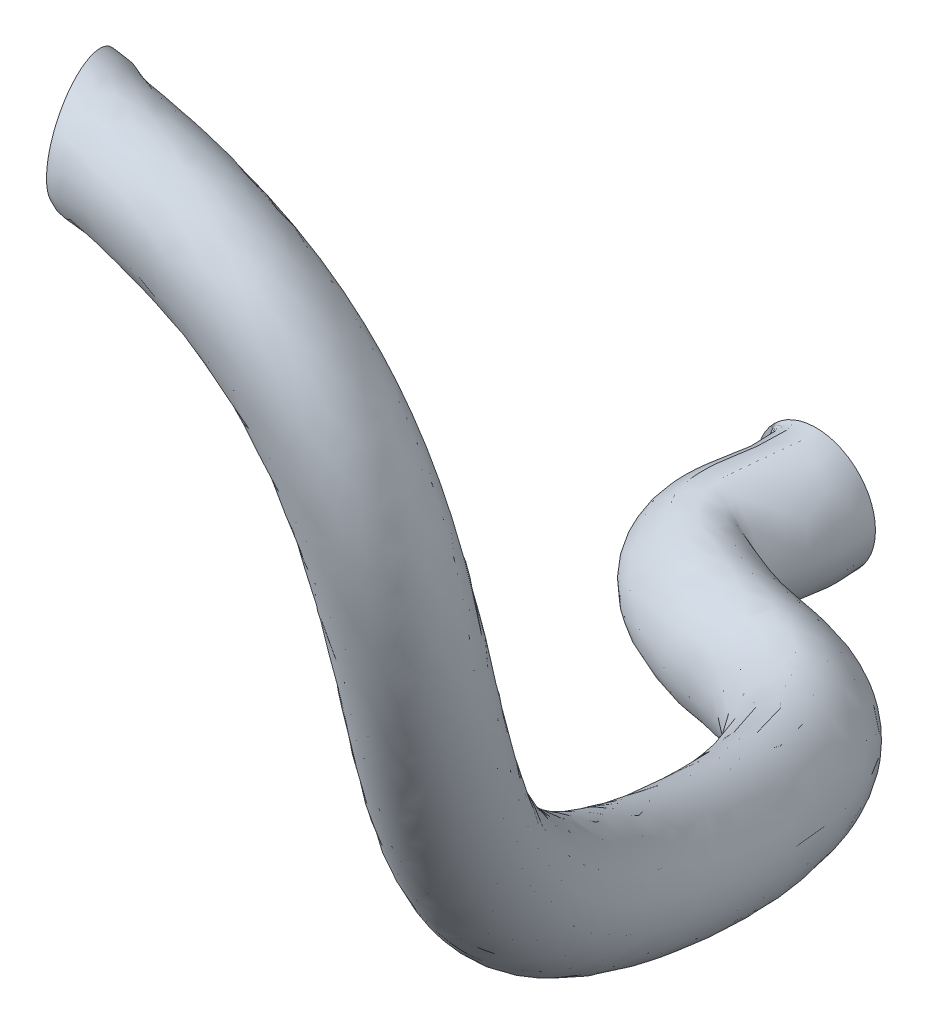
ISO-10303-21;
HEADER;
FILE_DESCRIPTION(('STEP AP214'),'2;1');
FILE_NAME('part.step','',(''),(''),'','','');
FILE_SCHEMA(('AUTOMOTIVE_DESIGN { 1 0 10303 214 1 1 1 1 }'));
ENDSEC;
DATA;
#1=APPLICATION_CONTEXT('core data for automotive mechanical design processes');
#2=APPLICATION_PROTOCOL_DEFINITION('international standard','automotive_design',2000,#1);
#3=PRODUCT_CONTEXT('',#1,'mechanical');
#4=PRODUCT('Part','Part','',(#3));
#5=PRODUCT_RELATED_PRODUCT_CATEGORY('part','',(#4));
#6=PRODUCT_DEFINITION_FORMATION('','',#4);
#7=PRODUCT_DEFINITION_CONTEXT('part definition',#1,'design');
#8=PRODUCT_DEFINITION('design','',#6,#7);
#9=PRODUCT_DEFINITION_SHAPE('','',#8);
#10=(LENGTH_UNIT() NAMED_UNIT(*) SI_UNIT(.MILLI.,.METRE.));
#11=(NAMED_UNIT(*) PLANE_ANGLE_UNIT() SI_UNIT($,.RADIAN.));
#12=(NAMED_UNIT(*) SI_UNIT($,.STERADIAN.) SOLID_ANGLE_UNIT());
#13=UNCERTAINTY_MEASURE_WITH_UNIT(LENGTH_MEASURE(1.E-05),#10,'distance_accuracy_value','');
#14=(GEOMETRIC_REPRESENTATION_CONTEXT(3) GLOBAL_UNCERTAINTY_ASSIGNED_CONTEXT((#13)) GLOBAL_UNIT_ASSIGNED_CONTEXT((#10,
#11,#12)) REPRESENTATION_CONTEXT('',''));
#15=CARTESIAN_POINT('',(0.,0.,0.));
#16=DIRECTION('',(0.,0.,1.));
#17=DIRECTION('',(1.,0.,0.));
#18=AXIS2_PLACEMENT_3D('',#15,#16,#17);
#19=CARTESIAN_POINT('',(-24.8878615693441,-4.2304804281548,-4.49999999999991));
#20=CARTESIAN_POINT('',(-24.5646060974888,-4.22796489126231,-2.55649872578834));
#21=CARTESIAN_POINT('',(-25.1030534950202,-4.23205726124832,-1.22840390737119));
#22=CARTESIAN_POINT('',(-25.413106233209,-4.23459618045612,0.76757658714747));
#23=CARTESIAN_POINT('',(-25.2022709289863,-4.23323848687239,1.43771966918417));
#24=CARTESIAN_POINT('',(-24.6043829366221,-4.2288643553895,1.03015312019135));
#25=CARTESIAN_POINT('',(-24.3728298522423,-4.22837394427956,1.05607574828052));
#26=CARTESIAN_POINT('',(-23.5333543372944,-4.23509486533892,1.29094542338443));
#27=CARTESIAN_POINT('',(-23.0122900733621,-4.24646464015012,1.41890242621499));
#28=CARTESIAN_POINT('',(-21.3029778738389,-4.27736718960124,1.72369019564689));
#29=CARTESIAN_POINT('',(-19.7867082582139,-4.30556048012508,1.83597786138884));
#30=CARTESIAN_POINT('',(-14.2154728812544,-3.88382735188603,4.7653411880431));
#31=CARTESIAN_POINT('',(-12.4114377277019,-3.09076446981266,8.48799900523907));
#32=CARTESIAN_POINT('',(-9.46436730094952,-0.879239149500008,16.0423497595564));
#33=CARTESIAN_POINT('',(-8.427648458505,0.601201151193356,20.1422658495879));
#34=CARTESIAN_POINT('',(-5.4688429849217,5.190969608008,28.5116664110525));
#35=CARTESIAN_POINT('',(-3.46496980335747,8.77740715301397,32.3319993496395));
#36=CARTESIAN_POINT('',(-0.817829924241152,14.807205024518,36.8451318202008));
#37=CARTESIAN_POINT('',(0.00334889550446943,16.9235975650303,38.1413650839852));
#38=CARTESIAN_POINT('',(1.38629479996227,21.2596439688515,40.3802270445532));
#39=CARTESIAN_POINT('',(1.99832213598993,23.4480030711831,41.3963450150199));
#40=CARTESIAN_POINT('',(2.51672044384308,28.0203979897937,42.6945537851135));
#41=CARTESIAN_POINT('',(2.42140900852664,30.3278802480842,43.0589216726515));
#42=CARTESIAN_POINT('',(1.77934216727178,34.5878310271851,43.8007959879889));
#43=CARTESIAN_POINT('',(1.18667629531365,36.5846831358808,44.0993980823092));
#44=CARTESIAN_POINT('',(-1.61579174893988,41.9575666929227,44.7997950061252));
#45=CARTESIAN_POINT('',(-4.88844543797425,44.5121311354086,44.9320937160294));
#46=CARTESIAN_POINT('',(-10.4836559159759,46.2411596474251,45.1885953474421));
#47=CARTESIAN_POINT('',(-11.305458718614,46.4633137662849,45.2119410263556));
#48=CARTESIAN_POINT('',(-12.171526602053,46.69669675658,45.1640416738391));
#49=CARTESIAN_POINT('',(-12.3801287722566,46.7546587955755,45.1268870463093));
#50=CARTESIAN_POINT('',(-12.7254454729642,46.8590540619634,45.0155404350546));
#51=CARTESIAN_POINT('',(-13.2208295139413,46.970207355954,45.0590724851351));
#52=CARTESIAN_POINT('',(-13.6107610039798,47.0583487138794,45.1043830996129));
#53=CARTESIAN_POINT('',(-24.8878615693441,-2.6596841013599,-4.49999999999991));
#54=CARTESIAN_POINT('',(-24.5646143846284,-2.65716848012922,-2.5519287429446));
#55=CARTESIAN_POINT('',(-25.1046509655989,-2.66127306220809,-1.22244045701026));
#56=CARTESIAN_POINT('',(-25.4147723008567,-2.66381294043069,0.773769460652891));
#57=CARTESIAN_POINT('',(-25.2025005381344,-2.66244487482944,1.44272059623179));
#58=CARTESIAN_POINT('',(-24.6041813189911,-2.65806637932871,1.02787142081473));
#59=CARTESIAN_POINT('',(-24.3722940995891,-2.65757115779752,1.05495982724658));
#60=CARTESIAN_POINT('',(-23.5245837672909,-2.66431954077901,1.29424438588244));
#61=CARTESIAN_POINT('',(-22.9920191805409,-2.67581625049957,1.42701567310858));
#62=CARTESIAN_POINT('',(-21.2724422406209,-2.7068825001478,1.73341160505658));
#63=CARTESIAN_POINT('',(-19.7822568846957,-2.73320807572521,1.84518752672371));
#64=CARTESIAN_POINT('',(-14.421738935216,-2.32054285806685,4.69523981166026));
#65=CARTESIAN_POINT('',(-12.6884852694002,-1.55372658272302,8.29230356656181));
#66=CARTESIAN_POINT('',(-9.81916905745962,0.607817857476395,15.6677637439267));
#67=CARTESIAN_POINT('',(-8.8023978851523,2.06300890983307,19.6853580626797));
#68=CARTESIAN_POINT('',(-5.94035612181905,6.50621221363957,27.7662508543834));
#69=CARTESIAN_POINT('',(-4.00585267080839,9.97072294574679,31.4469012046742));
#70=CARTESIAN_POINT('',(-1.44944432894534,15.8008528175429,35.8014522580994));
#71=CARTESIAN_POINT('',(-0.65634915138676,17.8475270113853,37.0522336574479));
#72=CARTESIAN_POINT('',(0.676898560770395,22.0364652093027,39.210457778667));
#73=CARTESIAN_POINT('',(1.31204732643601,24.1513554482756,40.1626009634191));
#74=CARTESIAN_POINT('',(1.61513438304508,28.5426894846685,41.5104270054655));
#75=CARTESIAN_POINT('',(1.33699476495147,30.7249903517053,41.9780669391968));
#76=CARTESIAN_POINT('',(0.524492010256694,34.6783306697652,42.8421205793201));
#77=CARTESIAN_POINT('',(-0.104963151791936,36.4901965698746,43.1864482355731));
#78=CARTESIAN_POINT('',(-2.83383630630969,41.2512882735633,43.98844716122));
#79=CARTESIAN_POINT('',(-5.74425050240786,43.3443918445749,44.2245274515886));
#80=CARTESIAN_POINT('',(-10.9452537304344,44.9264654788377,44.4607838541198));
#81=CARTESIAN_POINT('',(-11.7331525061249,45.1388759716117,44.4828111531887));
#82=CARTESIAN_POINT('',(-12.5476261843569,45.3569899474006,44.4350303229199));
#83=CARTESIAN_POINT('',(-12.7367504494539,45.4091229720769,44.398611656623));
#84=CARTESIAN_POINT('',(-13.0338445708985,45.49998004545,44.2903931804137));
#85=CARTESIAN_POINT('',(-13.5521978656232,45.6176067933511,44.3320394792633));
#86=CARTESIAN_POINT('',(-13.9598449960138,45.7101320623714,44.3778479474183));
#87=CARTESIAN_POINT('',(-26.3170652425492,-1.2304804281548,-4.49999999999991));
#88=CARTESIAN_POINT('',(-25.9953007217943,-1.22799353344375,-3.0943974079674));
#89=CARTESIAN_POINT('',(-26.3458520292034,-1.23064193433917,-1.92812570019491));
#90=CARTESIAN_POINT('',(-26.6503610578025,-1.23308829522631,0.0584900875496806));
#91=CARTESIAN_POINT('',(-26.613469039452,-1.23298912070251,0.885825135594758));
#92=CARTESIAN_POINT('',(-26.0463378790452,-1.2289930574938,1.38365073192303));
#93=CARTESIAN_POINT('',(-25.6749880449954,-1.22697202409296,1.67198297434717));
#94=CARTESIAN_POINT('',(-24.6078974603529,-1.23051615495049,2.24027941789326));
#95=CARTESIAN_POINT('',(-23.9569665689047,-1.23924466801511,2.4764415470262));
#96=CARTESIAN_POINT('',(-21.9918069456176,-1.27030706062629,2.97745774074335));
#97=CARTESIAN_POINT('',(-20.5386848179186,-1.29571763006718,3.09777432549534));
#98=CARTESIAN_POINT('',(-16.0407484848798,-1.0014136772814,5.25150398657327));
#99=CARTESIAN_POINT('',(-14.3443075926483,-0.372594527048156,8.32773412475361));
#100=CARTESIAN_POINT('',(-11.5376298767001,1.62441974353067,15.2785480649164));
#101=CARTESIAN_POINT('',(-10.5245821800283,3.01632629361994,19.2211118777696));
#102=CARTESIAN_POINT('',(-7.73566371225351,7.3025194953844,27.2775219442118));
#103=CARTESIAN_POINT('',(-5.84114104240599,10.6638307228618,30.9416312997578));
#104=CARTESIAN_POINT('',(-3.33301317921254,16.2980259015031,35.2583897490917));
#105=CARTESIAN_POINT('',(-2.55396706012759,18.2723577486996,36.4941351130002));
#106=CARTESIAN_POINT('',(-1.24031679465598,22.2909931886233,38.6168167619467));
#107=CARTESIAN_POINT('',(-0.594211505903249,24.326555569935,39.4868841425441));
#108=CARTESIAN_POINT('',(-0.353231883458828,28.4019410151263,41.0341548753933));
#109=CARTESIAN_POINT('',(-0.653037345844485,30.3684714337197,41.7343181441356));
#110=CARTESIAN_POINT('',(-1.36320218023664,33.9148308059667,42.8627510722104));
#111=CARTESIAN_POINT('',(-1.89129699779102,35.5108837340509,43.3013180961627));
#112=CARTESIAN_POINT('',(-4.12468800256378,39.6327415046493,44.3219418509533));
#113=CARTESIAN_POINT('',(-6.36125120771238,41.427072871021,44.7296150741728));
#114=CARTESIAN_POINT('',(-11.0064443966996,42.9649955122185,44.9515016702632));
#115=CARTESIAN_POINT('',(-11.759328476982,43.1794483037047,44.9783001764761));
#116=CARTESIAN_POINT('',(-12.5688229367121,43.4040249366521,44.9554156690189));
#117=CARTESIAN_POINT('',(-12.7740120057758,43.4605603047749,44.9351572989688));
#118=CARTESIAN_POINT('',(-13.119229323096,43.562941902668,44.8620214159879));
#119=CARTESIAN_POINT('',(-13.5435431931169,43.6673357665829,44.8681132056534));
#120=CARTESIAN_POINT('',(-13.9167855531073,43.7561794312678,44.8930772932306));
#121=CARTESIAN_POINT('',(-29.4586578961389,-1.2304804281548,-4.49999999999991));
#122=CARTESIAN_POINT('',(-29.1154451357277,-1.22786837753155,-4.26147069071464));
#123=CARTESIAN_POINT('',(-29.0709933050279,-1.22747993074795,-3.49124898901656));
#124=CARTESIAN_POINT('',(-29.3630284923746,-1.22971880921931,-1.52618130771087));
#125=CARTESIAN_POINT('',(-29.7145189771195,-1.23242958153051,-0.348312032979664));
#126=CARTESIAN_POINT('',(-29.2168060528016,-1.22928288685065,2.17026758535971));
#127=CARTESIAN_POINT('',(-28.5395658548957,-1.22391752310242,3.03051932526041));
#128=CARTESIAN_POINT('',(-27.0067159532351,-1.22036332886836,4.31320085205081));
#129=CARTESIAN_POINT('',(-26.1185997589632,-1.22275308271758,4.76700216678366));
#130=CARTESIAN_POINT('',(-23.6341440000007,-1.25347959661863,5.69260501141662));
#131=CARTESIAN_POINT('',(-22.2103235923895,-1.28061428251205,5.83271867474702));
#132=CARTESIAN_POINT('',(-19.1870293038198,-1.22834937878654,6.61445439812684));
#133=CARTESIAN_POINT('',(-17.4299451407049,-0.850374294847422,8.79700640096132));
#134=CARTESIAN_POINT('',(-14.6054473054477,0.884941056027117,15.1721687561166));
#135=CARTESIAN_POINT('',(-13.5606889967762,2.18823777896863,19.1144484035126));
#136=CARTESIAN_POINT('',(-10.7389784972978,6.42243078338384,27.6940575021789));
#137=CARTESIAN_POINT('',(-8.79359980155941,9.80074846876321,31.6011725787131));
#138=CARTESIAN_POINT('',(-6.21013621290835,15.4035873640538,36.1520203510886));
#139=CARTESIAN_POINT('',(-5.40580463528659,17.3583371523662,37.4456181025256));
#140=CARTESIAN_POINT('',(-4.03583595627976,21.2968393551141,39.65144802824));
#141=CARTESIAN_POINT('',(-3.41188953298822,23.3049655656058,40.4690507060984));
#142=CARTESIAN_POINT('',(-2.87680836905627,27.0479728998037,42.3554946511537));
#143=CARTESIAN_POINT('',(-2.85858206867615,28.7905720108483,43.3602331415517));
#144=CARTESIAN_POINT('',(-3.0029217930297,32.0555503855751,44.8254506429246));
#145=CARTESIAN_POINT('',(-3.2346335976908,33.5471881679386,45.3797180573527));
#146=CARTESIAN_POINT('',(-4.52607424690675,37.4875026742727,46.67770623279));
#147=CARTESIAN_POINT('',(-6.00589625744987,39.5480120453571,47.2550019315763));
#148=CARTESIAN_POINT('',(-10.2177545427172,41.28279428878,47.4857921100407));
#149=CARTESIAN_POINT('',(-10.9614794034974,41.5212235950807,47.5257151668684));
#150=CARTESIAN_POINT('',(-11.8632172442076,41.7905440953054,47.5573192683022));
#151=CARTESIAN_POINT('',(-12.1426748441772,41.868414468203,47.5711116020813));
#152=CARTESIAN_POINT('',(-12.6901189391614,42.0232049937659,47.5688359714479));
#153=CARTESIAN_POINT('',(-12.8619268769686,42.0852919813254,47.5018163986206));
#154=CARTESIAN_POINT('',(-13.1239667980968,42.1575473447785,47.4786948741654));
#155=CARTESIAN_POINT('',(-30.887861569344,-2.6596841013599,-4.49999999999992));
#156=CARTESIAN_POINT('',(-30.5070046331481,-2.65680621542304,-4.87658725928186));
#157=CARTESIAN_POINT('',(-30.3092874216518,-2.65523408018845,-4.20778603394942));
#158=CARTESIAN_POINT('',(-30.5955854749771,-2.65737769618657,-2.25272996812888));
#159=CARTESIAN_POINT('',(-31.1250696543933,-2.66137623372854,-0.914307773752864));
#160=CARTESIAN_POINT('',(-30.6593295002145,-2.65861991262624,2.53019894734077));
#161=CARTESIAN_POINT('',(-29.8432347193895,-2.6517374906217,3.6495731346611));
#162=CARTESIAN_POINT('',(-28.1059896159641,-2.6449290712911,5.25323270053014));
#163=CARTESIAN_POINT('',(-27.1204344687305,-2.64431964266556,5.80166421414418));
#164=CARTESIAN_POINT('',(-24.409074965762,-2.67474441122901,6.91896091725171));
#165=CARTESIAN_POINT('',(-22.9748517729494,-2.70436280667767,7.06854647389455));
#166=CARTESIAN_POINT('',(-20.4306926714899,-2.75395812196958,7.29828335392582));
#167=CARTESIAN_POINT('',(-18.5816188897573,-2.4662187237818,9.18854759554321));
#168=CARTESIAN_POINT('',(-15.6782687569244,-0.80448240364701,15.4645942298604));
#169=CARTESIAN_POINT('',(-14.6009347768222,0.481476344742493,19.4816458325591));
#170=CARTESIAN_POINT('',(-11.6762648462506,4.82536658714541,28.5617751706955));
#171=CARTESIAN_POINT('',(-9.64463354033218,8.32235726134289,32.7065322612743));
#172=CARTESIAN_POINT('',(-6.94434456130369,14.0926010432135,37.5081609893846));
#173=CARTESIAN_POINT('',(-6.10295771516136,16.1018762594551,38.8694323100657));
#174=CARTESIAN_POINT('',(-4.66214975620252,20.137771247741,41.1864579423551));
#175=CARTESIAN_POINT('',(-4.06932130620079,22.200262260252,42.0384009257765));
#176=CARTESIAN_POINT('',(-3.20454168038173,25.956800864556,44.0340000872535));
#177=CARTESIAN_POINT('',(-2.87528537323915,27.7114244374778,45.0833358458278));
#178=CARTESIAN_POINT('',(-2.60714176966841,31.1273666357789,46.5906006411234));
#179=CARTESIAN_POINT('',(-2.67054707311962,32.7398142969786,47.1558997661271));
#180=CARTESIAN_POINT('',(-3.60042756481714,37.1541839059642,48.4876257147519));
#181=CARTESIAN_POINT('',(-5.06557253976659,39.7556500192591,49.0476610705011));
#182=CARTESIAN_POINT('',(-9.43896706450225,41.7136977990152,49.3009220627713));
#183=CARTESIAN_POINT('',(-10.2093730194864,41.9719000619934,49.3480154071126));
#184=CARTESIAN_POINT('',(-11.2000185783276,42.2754685295893,49.4043001542165));
#185=CARTESIAN_POINT('',(-11.5309852891414,42.3683484119127,49.4329135418762));
#186=CARTESIAN_POINT('',(-12.2143041060756,42.5592991640973,49.4600281788316));
#187=CARTESIAN_POINT('',(-12.250927403128,42.5962418485023,49.362109190019));
#188=CARTESIAN_POINT('',(-12.4456727099832,42.6569696773703,49.3160137748315));
#189=CARTESIAN_POINT('',(-30.887861569344,-5.80127675494968,-4.49999999999992));
#190=CARTESIAN_POINT('',(-30.5077127841188,-5.79840455992326,-4.88643727670335));
#191=CARTESIAN_POINT('',(-30.3060924804944,-5.79680247826892,-4.21971293467127));
#192=CARTESIAN_POINT('',(-30.5922533396817,-5.79894417623743,-2.26511571513972));
#193=CARTESIAN_POINT('',(-31.1246104360972,-5.80296345781445,-0.924309627847716));
#194=CARTESIAN_POINT('',(-30.6597327354765,-5.80021586474781,2.53476234609371));
#195=CARTESIAN_POINT('',(-29.8443062246959,-5.79334306358595,3.65180497672831));
#196=CARTESIAN_POINT('',(-28.123530755971,-5.78647972041074,5.24663477553479));
#197=CARTESIAN_POINT('',(-27.1609762543729,-5.7856164219665,5.78543772035697));
#198=CARTESIAN_POINT('',(-24.4701462321979,-5.81571379013623,6.89951809843235));
#199=CARTESIAN_POINT('',(-22.9837545199859,-5.84906761547741,7.05012714322477));
#200=CARTESIAN_POINT('',(-20.0181605635668,-5.88052710960792,7.43848610669152));
#201=CARTESIAN_POINT('',(-18.0275238063606,-5.54029449795766,9.57993847290112));
#202=CARTESIAN_POINT('',(-14.9686652439042,-3.77859641760323,16.2137662611164));
#203=CARTESIAN_POINT('',(-13.8514359235276,-2.44213917253695,20.3954614063754));
#204=CARTESIAN_POINT('',(-10.7332385724559,2.19488137588226,30.0526062840336));
#205=CARTESIAN_POINT('',(-8.56286780543034,5.93572567587258,34.4767285512048));
#206=CARTESIAN_POINT('',(-5.68111575189532,12.1053054571661,39.5955201135874));
#207=CARTESIAN_POINT('',(-4.7835616213789,14.254017366745,41.0476951631404));
#208=CARTESIAN_POINT('',(-3.24335727781878,18.5841287668385,43.5259964741277));
#209=CARTESIAN_POINT('',(-2.69677168708894,20.7935575060629,44.505889028978));
#210=CARTESIAN_POINT('',(-1.40136955878974,24.9122178748103,46.4022536465494));
#211=CARTESIAN_POINT('',(-0.706456886090605,26.9172042302463,47.2450453127298));
#212=CARTESIAN_POINT('',(-0.0974414556364411,30.946367350608,48.507951458468));
#213=CARTESIAN_POINT('',(-0.0872681789084381,32.9287874289974,48.9817994595862));
#214=CARTESIAN_POINT('',(-1.16433845007752,38.5667407446699,50.1103214045885));
#215=CARTESIAN_POINT('',(-3.35396241091167,42.0911286009267,50.4627935993826));
#216=CARTESIAN_POINT('',(-8.51577143558324,44.34308613619,50.7565450494158));
#217=CARTESIAN_POINT('',(-9.35398544446573,44.6207756513446,50.8062751534464));
#218=CARTESIAN_POINT('',(-10.4478194137192,44.9548821479458,50.862322856055));
#219=CARTESIAN_POINT('',(-10.8177419347465,45.0594200589109,50.8894643212506));
#220=CARTESIAN_POINT('',(-11.597505910207,45.277447197123,50.9103226881115));
#221=CARTESIAN_POINT('',(-11.5883610377857,45.3017984267494,50.8148912063415));
#222=CARTESIAN_POINT('',(-11.7475047259152,45.3534029803863,50.7690840792207));
#223=CARTESIAN_POINT('',(-29.458657896139,-7.23048042815479,-4.49999999999992));
#224=CARTESIAN_POINT('',(-29.1128712533226,-7.227849383426,-4.27814057227947));
#225=CARTESIAN_POINT('',(-29.0648914168882,-7.22743360613826,-3.5140276914849));
#226=CARTESIAN_POINT('',(-29.3566645827376,-7.22966882144134,-1.54983634203824));
#227=CARTESIAN_POINT('',(-29.7136419347781,-7.23241921194148,-0.367414167210714));
#228=CARTESIAN_POINT('',(-29.2175761754237,-7.22928918658264,2.17898303498543));
#229=CARTESIAN_POINT('',(-28.5416122792897,-7.22394219729001,3.0347818296277));
#230=CARTESIAN_POINT('',(-27.040217062909,-7.22028310623977,4.30059974352394));
#231=CARTESIAN_POINT('',(-26.1960288660051,-7.22218800445078,4.73601184643803));
#232=CARTESIAN_POINT('',(-23.7507815272093,-7.25228922965807,5.65547196274824));
#233=CARTESIAN_POINT('',(-22.227326586763,-7.28655806113635,5.79754034445558));
#234=CARTESIAN_POINT('',(-18.399151013903,-7.19965629039142,6.8822219317732));
#235=CARTESIAN_POINT('',(-16.3717014831125,-6.72142655363253,9.5445079147093));
#236=CARTESIAN_POINT('',(-13.2502044246637,-4.79519830365749,16.6029819401267));
#237=CARTESIAN_POINT('',(-12.1292516286588,-3.39545655633477,20.8597075912856));
#238=CARTESIAN_POINT('',(-8.93793098201074,1.39857409415356,30.5413351942052));
#239=CARTESIAN_POINT('',(-6.72757943383273,5.24261789876696,34.9819984561025));
#240=CARTESIAN_POINT('',(-3.79754690162811,11.6081323732012,40.1385826226044));
#241=CARTESIAN_POINT('',(-2.88594371262491,13.8291866294308,41.6057937075793));
#242=CARTESIAN_POINT('',(-1.32614192240558,18.329600787518,44.1196374908567));
#243=CARTESIAN_POINT('',(-0.790512854749688,20.6183573844076,45.181605849853));
#244=CARTESIAN_POINT('',(0.566996707714161,25.0529663443485,46.8785257766217));
#245=CARTESIAN_POINT('',(1.28357522470716,27.2737231482319,47.4887941077839));
#246=CARTESIAN_POINT('',(1.79025273485512,31.7098672144065,48.4873209655849));
#247=CARTESIAN_POINT('',(1.69906566709147,33.9081002648146,48.8669295990162));
#248=CARTESIAN_POINT('',(0.126513246174942,40.1852875135969,49.7768267148161));
#249=CARTESIAN_POINT('',(-2.73696170559076,44.0084475744806,49.9577059767821));
#250=CARTESIAN_POINT('',(-8.45458076932081,46.3045561028091,50.2658272332751));
#251=CARTESIAN_POINT('',(-9.3278094736075,46.5802033192469,50.3107861301613));
#252=CARTESIAN_POINT('',(-10.4266226613647,46.9078471586966,50.341937509955));
#253=CARTESIAN_POINT('',(-10.7804803784247,47.007982726213,50.3529186789009));
#254=CARTESIAN_POINT('',(-11.5121211580096,47.214485339905,50.3386944525412));
#255=CARTESIAN_POINT('',(-11.5964762474829,47.2523216241955,50.2772158602032));
#256=CARTESIAN_POINT('',(-11.7905641688217,47.3073556114898,50.2538547334084));
#257=CARTESIAN_POINT('',(-26.3170652425492,-7.23048042815478,-4.49999999999991));
#258=CARTESIAN_POINT('',(-25.9952824793916,-7.22799395442573,-3.11176216803249));
#259=CARTESIAN_POINT('',(-26.3397501410637,-7.23059560972949,-1.95090440266324));
#260=CARTESIAN_POINT('',(-26.6439971481656,-7.23303830744836,0.0348350532223124));
#261=CARTESIAN_POINT('',(-26.6125919971105,-7.232978751113,0.866723001363343));
#262=CARTESIAN_POINT('',(-26.0471080016673,-7.22899935722618,1.39236618154905));
#263=CARTESIAN_POINT('',(-25.6770344693893,-7.22699669828046,1.67624547871447));
#264=CARTESIAN_POINT('',(-24.6413985700268,-7.23043593232198,2.22767830936638));
#265=CARTESIAN_POINT('',(-24.0343956759466,-7.23867958974823,2.44545122668057));
#266=CARTESIAN_POINT('',(-22.1084444728261,-7.2691166936659,2.94032469207495));
#267=CARTESIAN_POINT('',(-20.5556878122921,-7.30166140869027,3.0625959952039));
#268=CARTESIAN_POINT('',(-15.252870194963,-6.97272058888892,5.51927152021965));
#269=CARTESIAN_POINT('',(-13.2860639350559,-6.24364678583327,9.0752356384982));
#270=CARTESIAN_POINT('',(-10.1823869959161,-4.05571961615395,16.7093612489299));
#271=CARTESIAN_POINT('',(-9.09314481191096,-2.56736804167617,20.9663710655499));
#272=CARTESIAN_POINT('',(-5.93461619696646,2.27866280614336,30.1247996362274));
#273=CARTESIAN_POINT('',(-3.77512067467931,6.10570015286083,34.322457177166));
#274=CARTESIAN_POINT('',(-0.920423867932303,12.5025709106528,39.2449520205981));
#275=CARTESIAN_POINT('',(-0.0341061374659179,14.7432072257598,40.6543107180539));
#276=CARTESIAN_POINT('',(1.46937723921821,19.3237546210315,43.0850062245633));
#277=CARTESIAN_POINT('',(2.0271651723353,21.6399473887368,44.1994392862907));
#278=CARTESIAN_POINT('',(3.0905731933116,26.4069344596712,45.5571860008694));
#279=CARTESIAN_POINT('',(3.48911994754239,28.8516225710998,45.8628791103751));
#280=CARTESIAN_POINT('',(3.42997234764457,33.5691476348017,46.5246213948635));
#281=CARTESIAN_POINT('',(3.04240226699206,35.8717958309269,46.788529637826));
#282=CARTESIAN_POINT('',(0.527899490516295,42.3305263439736,47.4210623329794));
#283=CARTESIAN_POINT('',(-3.09231665586146,45.8875084001445,47.4323191193787));
#284=CARTESIAN_POINT('',(-9.24327062330187,47.9867573262477,47.7315367934977));
#285=CARTESIAN_POINT('',(-10.1256585470916,48.2384280278709,47.7633711397714));
#286=CARTESIAN_POINT('',(-11.1322283538694,48.5213280000432,47.7400339106704));
#287=CARTESIAN_POINT('',(-11.4118175400233,48.6001285627848,47.7169643757903));
#288=CARTESIAN_POINT('',(-11.9412315419442,48.7542222488072,47.6318798970793));
#289=CARTESIAN_POINT('',(-12.277924652116,48.8340122677135,47.6447896932437));
#290=CARTESIAN_POINT('',(-12.5833829238322,48.9059876979792,47.6682371524735));
#291=CARTESIAN_POINT('',(-24.8878615693441,-5.80127675494969,-4.49999999999991));
#292=CARTESIAN_POINT('',(-24.5645978103492,-5.7987613023954,-2.56106870863209));
#293=CARTESIAN_POINT('',(-25.1014560244415,-5.80284146028856,-1.23436735773212));
#294=CARTESIAN_POINT('',(-25.4114401655613,-5.80537942048154,0.761383713642049));
#295=CARTESIAN_POINT('',(-25.2020413198382,-5.80403209891535,1.43271874213655));
#296=CARTESIAN_POINT('',(-24.6045845542531,-5.79966233145028,1.03243481956797));
#297=CARTESIAN_POINT('',(-24.3733656048956,-5.7991767307616,1.05719166931445));
#298=CARTESIAN_POINT('',(-23.5421249072978,-5.80587018989883,1.28764646088641));
#299=CARTESIAN_POINT('',(-23.0325609661833,-5.81711302980067,1.4107891793214));
#300=CARTESIAN_POINT('',(-21.3335135070569,-5.84785187905468,1.7139687862372));
#301=CARTESIAN_POINT('',(-19.7911596317322,-5.87791288452495,1.82676819605396));
#302=CARTESIAN_POINT('',(-14.0092068272928,-5.44711184570521,4.83544256442595));
#303=CARTESIAN_POINT('',(-12.1343901860035,-4.6278023569023,8.68369444391633));
#304=CARTESIAN_POINT('',(-9.10956554443942,-2.36629615647641,16.4169357751861));
#305=CARTESIAN_POINT('',(-8.05289903185769,-0.860606607446357,20.5991736364961));
#306=CARTESIAN_POINT('',(-4.99732984802434,3.87572700237642,29.2570819677216));
#307=CARTESIAN_POINT('',(-2.92408693590655,7.58409136028114,33.2170974946048));
#308=CARTESIAN_POINT('',(-0.186215519536963,13.8135572314932,37.8888113823022));
#309=CARTESIAN_POINT('',(0.663046942395699,15.9996681186754,39.2304965105226));
#310=CARTESIAN_POINT('',(2.09569103915414,20.4828227284003,41.5499963104395));
#311=CARTESIAN_POINT('',(2.68459694554385,22.7446506940907,42.6300890666206));
#312=CARTESIAN_POINT('',(3.41830650464107,27.4981064949188,43.8786805647614));
#313=CARTESIAN_POINT('',(3.50582325210181,29.9307701444631,44.1397764061062));
#314=CARTESIAN_POINT('',(3.03419232428686,34.497331384605,44.7594713966576));
#315=CARTESIAN_POINT('',(2.47831574241924,36.679169701887,45.0123479290452));
#316=CARTESIAN_POINT('',(-0.397747191570066,42.6638451122821,45.6111428510305));
#317=CARTESIAN_POINT('',(-4.03264037354065,45.6798704262424,45.6396599804701));
#318=CARTESIAN_POINT('',(-10.0220581015175,47.5558538160125,45.9164068407644));
#319=CARTESIAN_POINT('',(-10.8777649311031,47.7877515609582,45.9410708995225));
#320=CARTESIAN_POINT('',(-11.7954270197491,48.0364035657594,45.8930530247583));
#321=CARTESIAN_POINT('',(-12.0235070950593,48.1001946190741,45.8551624359956));
#322=CARTESIAN_POINT('',(-12.4170463750298,48.2181280784767,45.7406876896956));
#323=CARTESIAN_POINT('',(-12.8894611622595,48.322807918557,45.7861054910069));
#324=CARTESIAN_POINT('',(-13.2616770119458,48.4065653653874,45.8309182518074));
#325=CARTESIAN_POINT('',(-24.8878615693441,-4.2304804281548,-4.49999999999991));
#326=CARTESIAN_POINT('',(-24.5646060974888,-4.22796489126231,-2.55649872578834));
#327=CARTESIAN_POINT('',(-25.1030534950202,-4.23205726124832,-1.22840390737119));
#328=CARTESIAN_POINT('',(-25.413106233209,-4.23459618045612,0.76757658714747));
#329=CARTESIAN_POINT('',(-25.2022709289863,-4.23323848687239,1.43771966918417));
#330=CARTESIAN_POINT('',(-24.6043829366221,-4.2288643553895,1.03015312019135));
#331=CARTESIAN_POINT('',(-24.3728298522423,-4.22837394427956,1.05607574828052));
#332=CARTESIAN_POINT('',(-23.5333543372944,-4.23509486533892,1.29094542338443));
#333=CARTESIAN_POINT('',(-23.0122900733621,-4.24646464015012,1.41890242621499));
#334=CARTESIAN_POINT('',(-21.3029778738389,-4.27736718960124,1.72369019564689));
#335=CARTESIAN_POINT('',(-19.7867082582139,-4.30556048012508,1.83597786138884));
#336=CARTESIAN_POINT('',(-14.2154728812544,-3.88382735188603,4.7653411880431));
#337=CARTESIAN_POINT('',(-12.4114377277019,-3.09076446981266,8.48799900523907));
#338=CARTESIAN_POINT('',(-9.46436730094952,-0.879239149500008,16.0423497595564));
#339=CARTESIAN_POINT('',(-8.427648458505,0.601201151193356,20.1422658495879));
#340=CARTESIAN_POINT('',(-5.4688429849217,5.190969608008,28.5116664110525));
#341=CARTESIAN_POINT('',(-3.46496980335747,8.77740715301397,32.3319993496395));
#342=CARTESIAN_POINT('',(-0.817829924241152,14.807205024518,36.8451318202008));
#343=CARTESIAN_POINT('',(0.00334889550446943,16.9235975650303,38.1413650839852));
#344=CARTESIAN_POINT('',(1.38629479996227,21.2596439688515,40.3802270445532));
#345=CARTESIAN_POINT('',(1.99832213598993,23.4480030711831,41.3963450150199));
#346=CARTESIAN_POINT('',(2.51672044384308,28.0203979897937,42.6945537851135));
#347=CARTESIAN_POINT('',(2.42140900852664,30.3278802480842,43.0589216726515));
#348=CARTESIAN_POINT('',(1.77934216727178,34.5878310271851,43.8007959879889));
#349=CARTESIAN_POINT('',(1.18667629531365,36.5846831358808,44.0993980823092));
#350=CARTESIAN_POINT('',(-1.61579174893988,41.9575666929227,44.7997950061252));
#351=CARTESIAN_POINT('',(-4.88844543797425,44.5121311354086,44.9320937160294));
#352=CARTESIAN_POINT('',(-10.4836559159759,46.2411596474251,45.1885953474421));
#353=CARTESIAN_POINT('',(-11.305458718614,46.4633137662849,45.2119410263556));
#354=CARTESIAN_POINT('',(-12.171526602053,46.69669675658,45.1640416738391));
#355=CARTESIAN_POINT('',(-12.3801287722566,46.7546587955755,45.1268870463093));
#356=CARTESIAN_POINT('',(-12.7254454729642,46.8590540619634,45.0155404350546));
#357=CARTESIAN_POINT('',(-13.2208295139413,46.970207355954,45.0590724851351));
#358=CARTESIAN_POINT('',(-13.6107610039798,47.0583487138794,45.1043830996129));
#359=B_SPLINE_SURFACE_WITH_KNOTS('',3,3,((#19,#20,#21,#22,#23,#24,#25,#26,#27,#28,#29,#30,#31,
#32,#33,#34,#35,#36,#37,#38,#39,#40,#41,#42,#43,#44,#45,#46,#47,#48,#49,#50,#51,#52),(#53,#54,
#55,#56,#57,#58,#59,#60,#61,#62,#63,#64,#65,#66,#67,#68,#69,#70,#71,#72,#73,#74,#75,#76,#77,#78,
#79,#80,#81,#82,#83,#84,#85,#86),(#87,#88,#89,#90,#91,#92,#93,#94,#95,#96,#97,#98,#99,#100,#101,
#102,#103,#104,#105,#106,#107,#108,#109,#110,#111,#112,#113,#114,#115,#116,#117,#118,#119,#120),
(#121,#122,#123,#124,#125,#126,#127,#128,#129,#130,#131,#132,#133,#134,#135,#136,#137,#138,#139,
#140,#141,#142,#143,#144,#145,#146,#147,#148,#149,#150,#151,#152,#153,#154),(#155,#156,#157,
#158,#159,#160,#161,#162,#163,#164,#165,#166,#167,#168,#169,#170,#171,#172,#173,#174,#175,#176,
#177,#178,#179,#180,#181,#182,#183,#184,#185,#186,#187,#188),(#189,#190,#191,#192,#193,#194,
#195,#196,#197,#198,#199,#200,#201,#202,#203,#204,#205,#206,#207,#208,#209,#210,#211,#212,#213,
#214,#215,#216,#217,#218,#219,#220,#221,#222),(#223,#224,#225,#226,#227,#228,#229,#230,#231,
#232,#233,#234,#235,#236,#237,#238,#239,#240,#241,#242,#243,#244,#245,#246,#247,#248,#249,#250,
#251,#252,#253,#254,#255,#256),(#257,#258,#259,#260,#261,#262,#263,#264,#265,#266,#267,#268,
#269,#270,#271,#272,#273,#274,#275,#276,#277,#278,#279,#280,#281,#282,#283,#284,#285,#286,#287,
#288,#289,#290),(#291,#292,#293,#294,#295,#296,#297,#298,#299,#300,#301,#302,#303,#304,#305,
#306,#307,#308,#309,#310,#311,#312,#313,#314,#315,#316,#317,#318,#319,#320,#321,#322,#323,#324),
(#325,#326,#327,#328,#329,#330,#331,#332,#333,#334,#335,#336,#337,#338,#339,#340,#341,#342,#343,
#344,#345,#346,#347,#348,#349,#350,#351,#352,#353,#354,#355,#356,#357,#358)),.UNSPECIFIED.,.T.,
.F.,.F.,(4,2,2,2,4),(4,2,2,2,2,2,2,2,2,2,2,2,2,2,2,2,4),(0.,0.25,0.5,0.75,1.),(0.,
0.0291403552003627,0.0582807104007253,0.0814268364431687,0.104572962485612,0.150865214570499,
0.252084032449032,0.353302850327566,0.502208918859286,0.576661953125147,0.651114987391007,
0.725568021656867,0.800021055922728,0.948927124454448,0.974463562227224,0.987231781113612,1.),.UNSPECIFIED.);
#360=CARTESIAN_POINT('',(-12.8536748609645,45.5317675213788,47.5734660133194));
#361=DIRECTION('',(-0.941767247083598,0.0661803652749827,0.329688658544165));
#362=DIRECTION('',(-0.252362047671759,0.508860397500185,-0.823027637902197));
#363=AXIS2_PLACEMENT_3D('',#360,#361,#362);
#364=CIRCLE('',#363,2.99999999999999);
#365=CARTESIAN_POINT('',(-13.6107610039798,47.0583487138794,45.1043830996128));
#366=VERTEX_POINT('',#365);
#367=EDGE_CURVE('E45',#366,#366,#364,.T.);
#368=CARTESIAN_POINT('',(-27.8878615693441,-4.23048042815479,-4.49999999999992));
#369=DIRECTION('',(0.,0.,1.));
#370=DIRECTION('',(1.,0.,0.));
#371=AXIS2_PLACEMENT_3D('',#368,#369,#370);
#372=CIRCLE('',#371,2.99999999999999);
#373=CARTESIAN_POINT('',(-24.8878615693441,-4.23048042815479,-4.49999999999992));
#374=VERTEX_POINT('',#373);
#375=EDGE_CURVE('E34',#374,#374,#372,.T.);
#376=ORIENTED_EDGE('',*,*,#367,.F.);
#377=EDGE_LOOP('',(#376));
#378=FACE_BOUND('',#377,.T.);
#379=ORIENTED_EDGE('',*,*,#375,.T.);
#380=EDGE_LOOP('',(#379));
#381=FACE_BOUND('',#380,.T.);
#382=ADVANCED_FACE('F28',(#378,#381),#359,.T.);
#383=CARTESIAN_POINT('',(-27.8878615693441,-4.23048042815479,-4.49999999999992));
#384=DIRECTION('',(0.,0.,1.));
#385=DIRECTION('',(1.,0.,0.));
#386=AXIS2_PLACEMENT_3D('',#383,#384,#385);
#387=PLANE('',#386);
#388=CARTESIAN_POINT('',(-27.8878615693441,-4.23048042815479,-4.49999999999992));
#389=DIRECTION('',(0.,0.,1.));
#390=DIRECTION('',(1.,0.,0.));
#391=AXIS2_PLACEMENT_3D('',#388,#389,#390);
#392=CIRCLE('',#391,2.);
#393=CARTESIAN_POINT('',(-25.8878615693441,-4.23048042815479,-4.49999999999992));
#394=VERTEX_POINT('',#393);
#395=EDGE_CURVE('E39',#394,#394,#392,.F.);
#396=ORIENTED_EDGE('',*,*,#395,.F.);
#397=EDGE_LOOP('',(#396));
#398=FACE_BOUND('',#397,.T.);
#399=ORIENTED_EDGE('',*,*,#375,.F.);
#400=EDGE_LOOP('',(#399));
#401=FACE_BOUND('',#400,.T.);
#402=ADVANCED_FACE('F101',(#398,#401),#387,.F.);
#403=CARTESIAN_POINT('',(-12.8536748609645,45.5317675213788,47.5734660133194));
#404=DIRECTION('',(-0.941767247083598,0.0661803652749827,0.329688658544165));
#405=DIRECTION('',(-0.252362047671759,0.508860397500185,-0.823027637902197));
#406=AXIS2_PLACEMENT_3D('',#403,#404,#405);
#407=PLANE('',#406);
#408=CARTESIAN_POINT('',(-12.8536748609645,45.5317675213788,47.5734660133194));
#409=DIRECTION('',(-0.941767247083598,0.0661803652749827,0.329688658544165));
#410=DIRECTION('',(-0.252362047671759,0.508860397500185,-0.823027637902197));
#411=AXIS2_PLACEMENT_3D('',#408,#409,#410);
#412=CIRCLE('',#411,2.);
#413=CARTESIAN_POINT('',(-13.358398956308,46.5494883163792,45.927410737515));
#414=VERTEX_POINT('',#413);
#415=EDGE_CURVE('E10',#414,#414,#412,.F.);
#416=ORIENTED_EDGE('',*,*,#415,.T.);
#417=EDGE_LOOP('',(#416));
#418=FACE_BOUND('',#417,.T.);
#419=ORIENTED_EDGE('',*,*,#367,.T.);
#420=EDGE_LOOP('',(#419));
#421=FACE_BOUND('',#420,.T.);
#422=ADVANCED_FACE('F109',(#418,#421),#407,.T.);
#423=CARTESIAN_POINT('',(-25.8878615693441,-4.23048042815479,-4.49999999999991));
#424=CARTESIAN_POINT('',(-25.5655999758862,-4.22798476341096,-2.93924902330013));
#425=CARTESIAN_POINT('',(-25.9704929043615,-4.23105076424516,-1.72596150352713));
#426=CARTESIAN_POINT('',(-26.2765750955632,-4.23352363974865,0.26316001568326));
#427=CARTESIAN_POINT('',(-26.1893657816958,-4.23306038002208,1.04488160752005));
#428=CARTESIAN_POINT('',(-25.3586835159831,-4.2271399586386,1.38486251840321));
#429=CARTESIAN_POINT('',(-24.3252290525108,-4.23094999353223,2.0013645503983));
#430=CARTESIAN_POINT('',(-21.8257499947002,-4.272010841448,2.58794841434919));
#431=CARTESIAN_POINT('',(-20.318807406255,-4.30075293528357,2.70653768591689));
#432=CARTESIAN_POINT('',(-15.2169651706361,-3.95606322920371,5.19918177842159));
#433=CARTESIAN_POINT('',(-13.3936266644212,-3.24284649331905,8.63737301006873));
#434=CARTESIAN_POINT('',(-10.4408839175338,-1.11462252635732,16.0084881738793));
#435=CARTESIAN_POINT('',(-9.39407127378695,0.337612390343711,20.1083138112394));
#436=CARTESIAN_POINT('',(-6.42482777232159,4.91082867026076,28.6442537970973));
#437=CARTESIAN_POINT('',(-4.4047666149432,8.5026795389451,32.5419378590822));
#438=CARTESIAN_POINT('',(-0.843273301198915,16.5291020143035,38.6587984141863));
#439=CARTESIAN_POINT('',(0.79542049586041,20.8895230332133,41.0058928637494));
#440=CARTESIAN_POINT('',(2.01944796796201,29.8227143930741,43.8182347770749));
#441=CARTESIAN_POINT('',(1.59329095302265,34.1879205766455,44.4980784170773));
#442=CARTESIAN_POINT('',(-1.74355695869356,41.2747159649896,45.5496580983784));
#443=CARTESIAN_POINT('',(-4.77533244419798,43.9140074978587,45.7359493191924));
#444=CARTESIAN_POINT('',(-10.232608138321,45.7056983674542,45.9952850488821));
#445=CARTESIAN_POINT('',(-11.0514954708403,45.9354844480156,46.0228084020092));
#446=CARTESIAN_POINT('',(-12.2454019555622,46.2656516554765,45.9820682825153));
#447=CARTESIAN_POINT('',(-12.4853370592787,46.3457752592745,45.8521357036498));
#448=CARTESIAN_POINT('',(-13.358398956308,46.5494883163792,45.9274107375151));
#449=CARTESIAN_POINT('',(-25.8878615693441,-5.27767797935139,-4.49999999999992));
#450=CARTESIAN_POINT('',(-25.5655961973197,-5.27518238378064,-2.9422862635824));
#451=CARTESIAN_POINT('',(-25.9694279239754,-5.27824023027181,-1.72993713710137));
#452=CARTESIAN_POINT('',(-26.2754643837984,-5.28071246643246,0.259031433346602));
#453=CARTESIAN_POINT('',(-26.189212708931,-5.28025612138418,1.04154765615505));
#454=CARTESIAN_POINT('',(-25.3589451910894,-5.27433989725156,1.38853289506581));
#455=CARTESIAN_POINT('',(-24.3364619276367,-5.2780852977873,1.99631308858126));
#456=CARTESIAN_POINT('',(-21.8461070835122,-5.31900063441719,2.5814674747454));
#457=CARTESIAN_POINT('',(-20.3217749886009,-5.34898787155015,2.70039790902898));
#458=CARTESIAN_POINT('',(-15.0794544679941,-4.99825289174983,5.24591602933905));
#459=CARTESIAN_POINT('',(-13.2089283032867,-4.26753841804207,8.7678366358547));
#460=CARTESIAN_POINT('',(-10.204349413196,-2.105993864345,16.258212184298));
#461=CARTESIAN_POINT('',(-9.1442383226851,-0.636926115416096,20.4129190025127));
#462=CARTESIAN_POINT('',(-6.11048568106205,4.03400026650637,29.1411975015416));
#463=CARTESIAN_POINT('',(-4.04417803664571,7.70713567712165,33.1320032890591));
#464=CARTESIAN_POINT('',(-0.402034467558934,15.9110408188903,39.3898251038397));
#465=CARTESIAN_POINT('',(1.18116661847899,20.3602678210805,41.8449279888089));
#466=CARTESIAN_POINT('',(2.69227575891138,29.5348736905621,44.5911135395145));
#467=CARTESIAN_POINT('',(2.47073833770045,34.1149578754687,45.1292898708702));
#468=CARTESIAN_POINT('',(-0.931527253779799,41.7455682445538,46.090556661642));
#469=CARTESIAN_POINT('',(-4.20479573457831,44.6925003584201,46.2076601621611));
#470=CARTESIAN_POINT('',(-9.92487626201495,46.5821611465116,46.4804927110955));
#471=CARTESIAN_POINT('',(-10.7663662791662,46.8184429777997,46.5088949841212));
#472=CARTESIAN_POINT('',(-12.006134279628,47.1621826425956,46.4680495115167));
#473=CARTESIAN_POINT('',(-12.2947833768805,47.2548643844036,46.3383237997144));
#474=CARTESIAN_POINT('',(-13.125676294952,47.4482994173846,46.4117675056448));
#475=CARTESIAN_POINT('',(-26.8406640181475,-6.23048042815479,-4.49999999999992));
#476=CARTESIAN_POINT('',(-26.5195022718475,-6.22800499289035,-3.30813072941916));
#477=CARTESIAN_POINT('',(-26.794957335058,-6.23007632989924,-2.20762850038764));
#478=CARTESIAN_POINT('',(-27.0971690388668,-6.23248505774353,-0.225334340267697));
#479=CARTESIAN_POINT('',(-27.129579827113,-6.23288722284941,0.664217162306236));
#480=CARTESIAN_POINT('',(-26.3300632714896,-6.22734645455287,1.90174611164557));
#481=CARTESIAN_POINT('',(-25.0547747883745,-6.22586339227153,2.64348915160945));
#482=CARTESIAN_POINT('',(-22.3627277273503,-6.26651051082467,3.399038078631));
#483=CARTESIAN_POINT('',(-20.8314604423091,-6.29815355432704,3.52428310845986));
#484=CARTESIAN_POINT('',(-15.9085633797706,-6.01532538720564,5.70180199987349));
#485=CARTESIAN_POINT('',(-13.9767108026618,-5.34476803733166,9.02886409890931));
#486=CARTESIAN_POINT('',(-10.9195637141736,-3.23227617079442,16.4531625001272));
#487=CARTESIAN_POINT('',(-9.83773550938972,-1.77476707157661,20.6577172885486));
#488=CARTESIAN_POINT('',(-6.73534324701988,2.96929080236174,29.7196759472121));
#489=CARTESIAN_POINT('',(-4.61153386248797,6.7215415388383,33.8689097440873));
#490=CARTESIAN_POINT('',(-0.865545501967095,15.0742510242398,40.3496479639906));
#491=CARTESIAN_POINT('',(0.632979282398965,19.6192885274758,42.8547763964323));
#492=CARTESIAN_POINT('',(2.58368637196603,28.8119360904324,45.7465022357431));
#493=CARTESIAN_POINT('',(2.76644931907933,33.4713630497819,46.3059137271268));
#494=CARTESIAN_POINT('',(-0.314429465722226,41.5233557323611,47.2971696496124));
#495=CARTESIAN_POINT('',(-3.57791325612414,44.8309256743384,47.4027662547558));
#496=CARTESIAN_POINT('',(-9.40568460987144,46.8694301533378,47.690579346253));
#497=CARTESIAN_POINT('',(-10.2649620231589,47.1188939557415,47.7237618109523));
#498=CARTESIAN_POINT('',(-11.5837591064038,47.4930762582005,47.7048546900514));
#499=CARTESIAN_POINT('',(-12.0308285785459,47.6262011058535,47.6021982416233));
#500=CARTESIAN_POINT('',(-12.6734802362096,47.7812476391124,47.6366467727555));
#501=CARTESIAN_POINT('',(-28.9350591205407,-6.23048042815479,-4.49999999999991));
#502=CARTESIAN_POINT('',(-28.6081800622491,-6.22798670910107,-4.08727400984554));
#503=CARTESIAN_POINT('',(-28.6117181856076,-6.22796832750509,-3.24971069293657));
#504=CARTESIAN_POINT('',(-28.9056139952482,-6.23023873373885,-1.28178193710694));
#505=CARTESIAN_POINT('',(-29.1969464522242,-6.23251419673469,-0.158540950076454));
#506=CARTESIAN_POINT('',(-28.4641953831659,-6.22779033918533,3.02252089647642));
#507=CARTESIAN_POINT('',(-26.6112627230071,-6.21494364178687,4.0761769756905));
#508=CARTESIAN_POINT('',(-23.45761909694,-6.2552922014859,5.20913625907807));
#509=CARTESIAN_POINT('',(-21.9458862919548,-6.28808465595696,5.34757934129434));
#510=CARTESIAN_POINT('',(-18.0060839257342,-6.16661585487574,6.61043560757587));
#511=CARTESIAN_POINT('',(-16.0338025013639,-5.66328788253345,9.34171228305117));
#512=CARTESIAN_POINT('',(-12.964775333341,-3.72526196246117,16.3822429609239));
#513=CARTESIAN_POINT('',(-11.8618067205525,-2.32682608134537,20.5866083056935));
#514=CARTESIAN_POINT('',(-8.73755310371965,2.38256499436315,29.9973663192153));
#515=CARTESIAN_POINT('',(-6.57983970193296,6.14615336943926,34.3086039300576));
#516=CARTESIAN_POINT('',(-2.76688625209769,14.4709906029735,40.99742154822));
#517=CARTESIAN_POINT('',(-1.34350658284159,19.0490212282595,43.3964963680772));
#518=CARTESIAN_POINT('',(0.999335895418309,27.7984979765474,46.7404531569747));
#519=CARTESIAN_POINT('',(1.66156928457471,32.202575619988,47.6298771633408));
#520=CARTESIAN_POINT('',(-0.582020295280965,40.09319651211,48.8676792374949));
#521=CARTESIAN_POINT('',(-3.34100995594777,43.5782184572292,49.0863574930356));
#522=CARTESIAN_POINT('',(-8.87989137388336,45.7479626710454,49.3801063061027));
#523=CARTESIAN_POINT('',(-9.73306264083583,46.0134108166596,49.4220384712123));
#524=CARTESIAN_POINT('',(-11.1338538405076,46.4273654455859,49.4515656693288));
#525=CARTESIAN_POINT('',(-11.8236434646613,46.6284374324859,49.3824153734824));
#526=CARTESIAN_POINT('',(-12.144934399536,46.7154929147862,49.3603918267121));
#527=CARTESIAN_POINT('',(-29.887861569344,-5.27767797935139,-4.49999999999991));
#528=CARTESIAN_POINT('',(-29.5132117038118,-5.27483316480763,-4.44110773693166));
#529=CARTESIAN_POINT('',(-29.439185561344,-5.27421424225915,-3.72016752172692));
#530=CARTESIAN_POINT('',(-29.7293398332121,-5.27642230360261,-1.75863485250849));
#531=CARTESIAN_POINT('',(-30.1375921197709,-5.27954369398333,-0.529804590501007));
#532=CARTESIAN_POINT('',(-29.4348372884961,-5.27518765445276,3.52905506024897));
#533=CARTESIAN_POINT('',(-27.3091349115552,-5.25723011058324,4.73254527790644));
#534=CARTESIAN_POINT('',(-23.937195566936,-5.29757524180488,6.03850034953862));
#535=CARTESIAN_POINT('',(-22.4501715807677,-5.32975769218533,6.18263720714611));
#536=CARTESIAN_POINT('',(-19.0854236255154,-5.28719640101786,6.98127839084237));
#537=CARTESIAN_POINT('',(-17.1376840501915,-4.87586651208125,9.36533265517675));
#538=CARTESIAN_POINT('',(-14.1104158795058,-3.0475273717606,16.1227658415859));
#539=CARTESIAN_POINT('',(-13.0099295837984,-1.69128115881471,20.2771108490892));
#540=CARTESIAN_POINT('',(-9.93442483068312,2.91343651551743,29.6715470457639));
#541=CARTESIAN_POINT('',(-7.80336528298866,6.60822522084612,33.9717573267737));
#542=CARTESIAN_POINT('',(-4.03332781421178,14.7588982826935,40.6269815190898));
#543=CARTESIAN_POINT('',(-2.59364332634889,19.2711375064303,42.8795369238822));
#544=CARTESIAN_POINT('',(-0.333610760303171,27.5993494664548,46.4894199672048));
#545=CARTESIAN_POINT('',(0.360572909521946,31.6917523812497,47.6578737750049));
#546=CARTESIAN_POINT('',(-1.44258809278477,39.014165332821,49.0900090306807));
#547=CARTESIAN_POINT('',(-3.75234375948959,42.3000058082041,49.4230825747476));
#548=CARTESIAN_POINT('',(-8.92068515139258,44.4403160266308,49.7072515168669));
#549=CARTESIAN_POINT('',(-9.75051328807502,44.7071257047201,49.7523644867402));
#550=CARTESIAN_POINT('',(-11.1468785157427,45.1268249177903,49.804021749572));
#551=CARTESIAN_POINT('',(-11.8928274309965,45.3479384998413,49.7372406949468));
#552=CARTESIAN_POINT('',(-12.116228104265,45.4128578273838,49.7038780572536));
#553=CARTESIAN_POINT('',(-29.887861569344,-3.18328287695819,-4.49999999999991));
#554=CARTESIAN_POINT('',(-29.5143724938041,-3.18044665287094,-4.43434548717752));
#555=CARTESIAN_POINT('',(-29.4413155221162,-3.17983531020542,-3.71221625457841));
#556=CARTESIAN_POINT('',(-29.7315612567417,-3.18204465023543,-1.75037768783518));
#557=CARTESIAN_POINT('',(-30.1378982653006,-3.18515221125951,-0.523136687771368));
#558=CARTESIAN_POINT('',(-29.4343139382837,-3.18078777722623,3.52171430692441));
#559=CARTESIAN_POINT('',(-27.2866691613034,-3.16295950207278,4.74264820154053));
#560=CARTESIAN_POINT('',(-23.896481389312,-3.20359565586682,6.0514622287462));
#561=CARTESIAN_POINT('',(-22.4442364160758,-3.23328781965156,6.19491676092193));
#562=CARTESIAN_POINT('',(-19.3604450307992,-3.20281707592695,6.8878098890074));
#563=CARTESIAN_POINT('',(-17.5070807724605,-2.82648266263519,9.10440540360482));
#564=CARTESIAN_POINT('',(-14.5834848881814,-1.06478469578524,15.6233178207486));
#565=CARTESIAN_POINT('',(-13.5095954859948,0.257795852704933,19.6679004665498));
#566=CARTESIAN_POINT('',(-10.5631090132129,4.66709332302619,28.6776596368647));
#567=CARTESIAN_POINT('',(-8.52454243959302,8.19931294450239,32.7916264668199));
#568=CARTESIAN_POINT('',(-4.91580548148236,15.9950206735106,39.1649281397829));
#569=CARTESIAN_POINT('',(-3.36513557158606,20.329647930696,41.2014666737953));
#570=CARTESIAN_POINT('',(-1.67926634220191,28.1750308714789,44.9436624422933));
#571=CARTESIAN_POINT('',(-1.39432185983367,31.8376777836163,46.395450867432));
#572=CARTESIAN_POINT('',(-3.06664750261228,38.0724607736795,48.0082119041403));
#573=CARTESIAN_POINT('',(-4.89341717872483,40.7430200870815,48.4796608888266));
#574=CARTESIAN_POINT('',(-9.53614890400548,42.6873904685161,48.7368361924372));
#575=CARTESIAN_POINT('',(-10.3207716714233,42.9412086451542,48.7801913225162));
#576=CARTESIAN_POINT('',(-11.6254138676111,43.3337629435498,48.8320592915692));
#577=CARTESIAN_POINT('',(-12.2758971577236,43.527553925962,48.7759930553948));
#578=CARTESIAN_POINT('',(-12.581673426977,43.6152356253731,48.7351645209942));
#579=CARTESIAN_POINT('',(-28.9350591205407,-2.23048042815478,-4.49999999999991));
#580=CARTESIAN_POINT('',(-28.6087709512378,-2.22799084186966,-4.07637809311231));
#581=CARTESIAN_POINT('',(-28.6157861110319,-2.22799921057842,-3.23452489129216));
#582=CARTESIAN_POINT('',(-28.9098566016751,-2.23027205892393,-1.26601191422087));
#583=CARTESIAN_POINT('',(-29.1975311471185,-2.23252110979409,-0.145806193922571));
#584=CARTESIAN_POINT('',(-28.4631958578835,-2.22778121992523,3.00850109034465));
#585=CARTESIAN_POINT('',(-26.568356300571,-2.21518140758855,4.09547213851229));
#586=CARTESIAN_POINT('',(-23.3798607454685,-2.25608577945936,5.23389162486059));
#587=CARTESIAN_POINT('',(-21.9345509623725,-2.28412213687498,5.37103156149105));
#588=CARTESIAN_POINT('',(-18.5313361190121,-2.18574458047048,6.431923918473));
#589=CARTESIAN_POINT('',(-16.7392982730922,-1.74925304334221,8.84337794055021));
#590=CARTESIAN_POINT('',(-13.868270587197,0.0614976106607726,15.4283675049194));
#591=CARTESIAN_POINT('',(-12.8160982992975,1.39563680885813,19.4231021805212));
#592=CARTESIAN_POINT('',(-9.93825144724435,5.73180278718157,28.0991811911834));
#593=CARTESIAN_POINT('',(-7.95718661375076,9.18490708278573,32.0547200117917));
#594=CARTESIAN_POINT('',(-4.4522944470742,16.831810468161,38.2051052796321));
#595=CARTESIAN_POINT('',(-2.81694823549,21.0706272243007,40.191618266156));
#596=CARTESIAN_POINT('',(-1.57067695527262,28.8979684716086,43.7882737460808));
#597=CARTESIAN_POINT('',(-1.69003284121416,32.48127260929,45.2188270111754));
#598=CARTESIAN_POINT('',(-3.68374529066823,38.2946732858852,46.8015989161701));
#599=CARTESIAN_POINT('',(-5.5202996571872,40.6045947711468,47.2845547961992));
#600=CARTESIAN_POINT('',(-10.0553405561476,42.4001214616927,47.5267495572854));
#601=CARTESIAN_POINT('',(-10.82217592743,42.6407576672124,47.5653244956806));
#602=CARTESIAN_POINT('',(-12.0477890408359,43.0028693279448,47.595254113039));
#603=CARTESIAN_POINT('',(-12.5514754777977,43.1530788540321,47.5371871005502));
#604=CARTESIAN_POINT('',(-13.0338694857194,43.2822874036453,47.5102852538835));
#605=CARTESIAN_POINT('',(-26.8406640181475,-2.23048042815476,-4.49999999999991));
#606=CARTESIAN_POINT('',(-26.5195143552364,-2.22800471306567,-3.29659844102499));
#607=CARTESIAN_POINT('',(-26.7990252604822,-2.23010721297213,-2.19244269874324));
#608=CARTESIAN_POINT('',(-27.1014116452937,-2.23251838292905,-0.209564317381641));
#609=CARTESIAN_POINT('',(-27.1301645220073,-2.23289413590879,0.676951918460914));
#610=CARTESIAN_POINT('',(-26.3290637462072,-2.22733733529277,1.88772630551258));
#611=CARTESIAN_POINT('',(-25.0118683659384,-2.22610115807321,2.66278431443128));
#612=CARTESIAN_POINT('',(-22.2849693758789,-2.26730408879813,3.42379344441349));
#613=CARTESIAN_POINT('',(-20.8201251127268,-2.29419103524506,3.54773532865658));
#614=CARTESIAN_POINT('',(-16.4338155730485,-2.03445411280039,5.52329031077059));
#615=CARTESIAN_POINT('',(-14.6822065743901,-1.43073319814725,8.53052975640833));
#616=CARTESIAN_POINT('',(-11.8230589680297,0.554483402334376,15.4992870441227));
#617=CARTESIAN_POINT('',(-10.7920270881347,1.94769581863056,19.4942111633616));
#618=CARTESIAN_POINT('',(-7.93604159054459,6.3185285951748,27.8214908192017));
#619=CARTESIAN_POINT('',(-5.98888077430576,9.7602952521801,31.6150258258215));
#620=CARTESIAN_POINT('',(-2.55095369694362,17.4350708894321,37.5573316954027));
#621=CARTESIAN_POINT('',(-0.840462370257448,21.640894523517,39.6498982944951));
#622=CARTESIAN_POINT('',(0.0136735212831309,29.9114065854935,42.7943228248652));
#623=CARTESIAN_POINT('',(-0.585152806709535,33.750060039071,43.8948635749744));
#624=CARTESIAN_POINT('',(-3.4161544611095,39.7248325061493,45.2310893282746));
#625=CARTESIAN_POINT('',(-5.75720295736356,41.8573019882724,45.600963557952));
#626=CARTESIAN_POINT('',(-10.5811337921357,43.5215889439822,45.83722259743));
#627=CARTESIAN_POINT('',(-11.3540753097531,43.7462408062966,45.8670478354229));
#628=CARTESIAN_POINT('',(-12.4976943067321,44.0685801405572,45.8485431337593));
#629=CARTESIAN_POINT('',(-12.7581177265021,44.1531281596079,45.7470000303414));
#630=CARTESIAN_POINT('',(-13.562415322393,44.3480421279715,45.7865401999267));
#631=CARTESIAN_POINT('',(-25.8878615693441,-3.18328287695819,-4.49999999999991));
#632=CARTESIAN_POINT('',(-25.5656037544527,-3.18078714304129,-2.93621178301787));
#633=CARTESIAN_POINT('',(-25.9715578847475,-3.18386129821851,-1.72198586995289));
#634=CARTESIAN_POINT('',(-26.2776858073281,-3.18633481306485,0.267288598019919));
#635=CARTESIAN_POINT('',(-26.1895188544607,-3.18586463865998,1.04821555888505));
#636=CARTESIAN_POINT('',(-25.3584218408769,-3.17994002002564,1.38119214174061));
#637=CARTESIAN_POINT('',(-24.3139961773848,-3.18381468927717,2.00641601221534));
#638=CARTESIAN_POINT('',(-21.8053929058882,-3.22502104847881,2.59442935395297));
#639=CARTESIAN_POINT('',(-20.3158398239091,-3.25251799901699,2.71267746280481));
#640=CARTESIAN_POINT('',(-15.354475873278,-2.9138735666576,5.15244752750413));
#641=CARTESIAN_POINT('',(-13.5783250255557,-2.21815456859603,8.50690938428276));
#642=CARTESIAN_POINT('',(-10.6774184218716,-0.123251188369637,15.7587641634606));
#643=CARTESIAN_POINT('',(-9.6439042248888,1.31215089610352,19.803708619966));
#644=CARTESIAN_POINT('',(-6.73916986358114,5.78765707401514,28.1473100926531));
#645=CARTESIAN_POINT('',(-4.76535519324068,9.29822340076855,31.9518724291054));
#646=CARTESIAN_POINT('',(-1.2845121348389,17.1471632097168,37.9277717245329));
#647=CARTESIAN_POINT('',(0.409674373241829,21.4187782453462,40.1668577386899));
#648=CARTESIAN_POINT('',(1.34662017701264,30.1105550955861,43.0453560146352));
#649=CARTESIAN_POINT('',(0.715843568344843,34.2608832778222,43.8668669632844));
#650=CARTESIAN_POINT('',(-2.55558666360731,40.8038636854253,45.0087595351147));
#651=CARTESIAN_POINT('',(-5.34586915381765,43.1355146372974,45.2642384762237));
#652=CARTESIAN_POINT('',(-10.5403400146271,44.8292355883969,45.5100773866686));
#653=CARTESIAN_POINT('',(-11.3366246625145,45.0525259182315,45.5367218198971));
#654=CARTESIAN_POINT('',(-12.4846696314964,45.3691206683574,45.4960870535139));
#655=CARTESIAN_POINT('',(-12.6758907416769,45.4366861341454,45.3659476075853));
#656=CARTESIAN_POINT('',(-13.591121617664,45.6506772153739,45.4430539693854));
#657=CARTESIAN_POINT('',(-25.8878615693441,-4.23048042815479,-4.49999999999991));
#658=CARTESIAN_POINT('',(-25.5655999758862,-4.22798476341096,-2.93924902330013));
#659=CARTESIAN_POINT('',(-25.9704929043615,-4.23105076424516,-1.72596150352713));
#660=CARTESIAN_POINT('',(-26.2765750955632,-4.23352363974865,0.26316001568326));
#661=CARTESIAN_POINT('',(-26.1893657816958,-4.23306038002208,1.04488160752005));
#662=CARTESIAN_POINT('',(-25.3586835159831,-4.2271399586386,1.38486251840321));
#663=CARTESIAN_POINT('',(-24.3252290525108,-4.23094999353223,2.0013645503983));
#664=CARTESIAN_POINT('',(-21.8257499947002,-4.272010841448,2.58794841434919));
#665=CARTESIAN_POINT('',(-20.318807406255,-4.30075293528357,2.70653768591689));
#666=CARTESIAN_POINT('',(-15.2169651706361,-3.95606322920371,5.19918177842159));
#667=CARTESIAN_POINT('',(-13.3936266644212,-3.24284649331905,8.63737301006873));
#668=CARTESIAN_POINT('',(-10.4408839175338,-1.11462252635732,16.0084881738793));
#669=CARTESIAN_POINT('',(-9.39407127378695,0.337612390343711,20.1083138112394));
#670=CARTESIAN_POINT('',(-6.42482777232159,4.91082867026076,28.6442537970973));
#671=CARTESIAN_POINT('',(-4.4047666149432,8.5026795389451,32.5419378590822));
#672=CARTESIAN_POINT('',(-0.843273301198915,16.5291020143035,38.6587984141863));
#673=CARTESIAN_POINT('',(0.79542049586041,20.8895230332133,41.0058928637494));
#674=CARTESIAN_POINT('',(2.01944796796201,29.8227143930741,43.8182347770749));
#675=CARTESIAN_POINT('',(1.59329095302265,34.1879205766455,44.4980784170773));
#676=CARTESIAN_POINT('',(-1.74355695869356,41.2747159649896,45.5496580983784));
#677=CARTESIAN_POINT('',(-4.77533244419798,43.9140074978587,45.7359493191924));
#678=CARTESIAN_POINT('',(-10.232608138321,45.7056983674542,45.9952850488821));
#679=CARTESIAN_POINT('',(-11.0514954708403,45.9354844480156,46.0228084020092));
#680=CARTESIAN_POINT('',(-12.2454019555622,46.2656516554765,45.9820682825153));
#681=CARTESIAN_POINT('',(-12.4853370592787,46.3457752592745,45.8521357036498));
#682=CARTESIAN_POINT('',(-13.358398956308,46.5494883163792,45.9274107375151));
#683=B_SPLINE_SURFACE_WITH_KNOTS('',3,3,((#423,#424,#425,#426,#427,#428,#429,#430,#431,#432,
#433,#434,#435,#436,#437,#438,#439,#440,#441,#442,#443,#444,#445,#446,#447,#448),(#449,#450,
#451,#452,#453,#454,#455,#456,#457,#458,#459,#460,#461,#462,#463,#464,#465,#466,#467,#468,#469,
#470,#471,#472,#473,#474),(#475,#476,#477,#478,#479,#480,#481,#482,#483,#484,#485,#486,#487,
#488,#489,#490,#491,#492,#493,#494,#495,#496,#497,#498,#499,#500),(#501,#502,#503,#504,#505,
#506,#507,#508,#509,#510,#511,#512,#513,#514,#515,#516,#517,#518,#519,#520,#521,#522,#523,#524,
#525,#526),(#527,#528,#529,#530,#531,#532,#533,#534,#535,#536,#537,#538,#539,#540,#541,#542,
#543,#544,#545,#546,#547,#548,#549,#550,#551,#552),(#553,#554,#555,#556,#557,#558,#559,#560,
#561,#562,#563,#564,#565,#566,#567,#568,#569,#570,#571,#572,#573,#574,#575,#576,#577,#578),
(#579,#580,#581,#582,#583,#584,#585,#586,#587,#588,#589,#590,#591,#592,#593,#594,#595,#596,#597,
#598,#599,#600,#601,#602,#603,#604),(#605,#606,#607,#608,#609,#610,#611,#612,#613,#614,#615,
#616,#617,#618,#619,#620,#621,#622,#623,#624,#625,#626,#627,#628,#629,#630),(#631,#632,#633,
#634,#635,#636,#637,#638,#639,#640,#641,#642,#643,#644,#645,#646,#647,#648,#649,#650,#651,#652,
#653,#654,#655,#656),(#657,#658,#659,#660,#661,#662,#663,#664,#665,#666,#667,#668,#669,#670,
#671,#672,#673,#674,#675,#676,#677,#678,#679,#680,#681,#682)),.UNSPECIFIED.,.T.,.F.,.F.,(4,2,2,
2,4),(4,2,2,2,2,2,2,2,2,2,2,2,4),(0.,0.25,0.5,0.75,1.),(0.,0.0291403552003627,
0.0582807104007253,0.104572962485612,0.150865214570499,0.252084032449032,0.353302850327566,
0.502208918859286,0.651114987391007,0.800021055922728,0.948927124454448,0.974463562227224,1.),.UNSPECIFIED.);
#684=ORIENTED_EDGE('',*,*,#415,.F.);
#685=EDGE_LOOP('',(#684));
#686=FACE_BOUND('',#685,.T.);
#687=ORIENTED_EDGE('',*,*,#395,.T.);
#688=EDGE_LOOP('',(#687));
#689=FACE_BOUND('',#688,.T.);
#690=ADVANCED_FACE('F114',(#686,#689),#683,.T.);
#691=CLOSED_SHELL('',(#382,#402,#422,#690));
#692=MANIFOLD_SOLID_BREP('B2',#691);
#693=ADVANCED_BREP_SHAPE_REPRESENTATION('',(#18,#692),#14);
#694=SHAPE_DEFINITION_REPRESENTATION(#9,#693);
ENDSEC;
END-ISO-10303-21;
